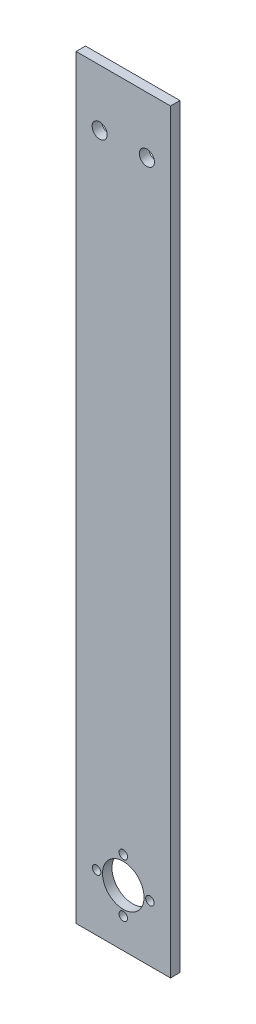
ISO-10303-21;
HEADER;
FILE_DESCRIPTION(('STEP AP214'),'2;1');
FILE_NAME('part.step','',(''),(''),'','','');
FILE_SCHEMA(('AUTOMOTIVE_DESIGN { 1 0 10303 214 1 1 1 1 }'));
ENDSEC;
DATA;
#1=APPLICATION_CONTEXT('core data for automotive mechanical design processes');
#2=APPLICATION_PROTOCOL_DEFINITION('international standard','automotive_design',2000,#1);
#3=PRODUCT_CONTEXT('',#1,'mechanical');
#4=PRODUCT('Part','Part','',(#3));
#5=PRODUCT_RELATED_PRODUCT_CATEGORY('part','',(#4));
#6=PRODUCT_DEFINITION_FORMATION('','',#4);
#7=PRODUCT_DEFINITION_CONTEXT('part definition',#1,'design');
#8=PRODUCT_DEFINITION('design','',#6,#7);
#9=PRODUCT_DEFINITION_SHAPE('','',#8);
#10=(LENGTH_UNIT() NAMED_UNIT(*) SI_UNIT(.MILLI.,.METRE.));
#11=(NAMED_UNIT(*) PLANE_ANGLE_UNIT() SI_UNIT($,.RADIAN.));
#12=(NAMED_UNIT(*) SI_UNIT($,.STERADIAN.) SOLID_ANGLE_UNIT());
#13=UNCERTAINTY_MEASURE_WITH_UNIT(LENGTH_MEASURE(1.E-05),#10,'distance_accuracy_value','');
#14=(GEOMETRIC_REPRESENTATION_CONTEXT(3) GLOBAL_UNCERTAINTY_ASSIGNED_CONTEXT((#13)) GLOBAL_UNIT_ASSIGNED_CONTEXT((#10,
#11,#12)) REPRESENTATION_CONTEXT('',''));
#15=CARTESIAN_POINT('',(0.,0.,0.));
#16=DIRECTION('',(0.,0.,1.));
#17=DIRECTION('',(1.,0.,0.));
#18=AXIS2_PLACEMENT_3D('',#15,#16,#17);
#19=CARTESIAN_POINT('',(0.,0.,5.));
#20=DIRECTION('',(0.,0.,1.));
#21=DIRECTION('',(1.,0.,0.));
#22=AXIS2_PLACEMENT_3D('',#19,#20,#21);
#23=PLANE('',#22);
#24=CARTESIAN_POINT('',(11.4736005745586,-322.394322930041,5.));
#25=DIRECTION('',(0.,0.,1.));
#26=DIRECTION('',(1.,0.,0.));
#27=AXIS2_PLACEMENT_3D('',#24,#25,#26);
#28=CIRCLE('',#27,2.25);
#29=CARTESIAN_POINT('',(13.7236005745586,-322.394322930041,5.));
#30=VERTEX_POINT('',#29);
#31=EDGE_CURVE('E147',#30,#30,#28,.T.);
#32=ORIENTED_EDGE('',*,*,#31,.F.);
#33=EDGE_LOOP('',(#32));
#34=FACE_BOUND('',#33,.T.);
#35=CARTESIAN_POINT('',(11.4736005745586,-308.269322930041,5.));
#36=DIRECTION('',(0.,0.,1.));
#37=DIRECTION('',(1.,0.,0.));
#38=AXIS2_PLACEMENT_3D('',#35,#36,#37);
#39=CIRCLE('',#38,11.);
#40=CARTESIAN_POINT('',(22.4736005745586,-308.269322930041,5.));
#41=VERTEX_POINT('',#40);
#42=EDGE_CURVE('E154',#41,#41,#39,.T.);
#43=ORIENTED_EDGE('',*,*,#42,.F.);
#44=EDGE_LOOP('',(#43));
#45=FACE_BOUND('',#44,.T.);
#46=CARTESIAN_POINT('',(25.5986005745586,-308.269322930041,5.));
#47=DIRECTION('',(0.,0.,1.));
#48=DIRECTION('',(1.,0.,0.));
#49=AXIS2_PLACEMENT_3D('',#46,#47,#48);
#50=CIRCLE('',#49,2.25);
#51=CARTESIAN_POINT('',(27.8486005745586,-308.269322930041,5.));
#52=VERTEX_POINT('',#51);
#53=EDGE_CURVE('E158',#52,#52,#50,.T.);
#54=ORIENTED_EDGE('',*,*,#53,.F.);
#55=EDGE_LOOP('',(#54));
#56=FACE_BOUND('',#55,.T.);
#57=CARTESIAN_POINT('',(11.4736005745586,-294.144322930041,5.));
#58=DIRECTION('',(0.,0.,1.));
#59=DIRECTION('',(1.,0.,0.));
#60=AXIS2_PLACEMENT_3D('',#57,#58,#59);
#61=CIRCLE('',#60,2.25);
#62=CARTESIAN_POINT('',(13.7236005745586,-294.144322930041,5.));
#63=VERTEX_POINT('',#62);
#64=EDGE_CURVE('E162',#63,#63,#61,.T.);
#65=ORIENTED_EDGE('',*,*,#64,.F.);
#66=EDGE_LOOP('',(#65));
#67=FACE_BOUND('',#66,.T.);
#68=CARTESIAN_POINT('',(-2.65139942544137,-308.269322930041,5.));
#69=DIRECTION('',(0.,0.,1.));
#70=DIRECTION('',(1.,0.,0.));
#71=AXIS2_PLACEMENT_3D('',#68,#69,#70);
#72=CIRCLE('',#71,2.25);
#73=CARTESIAN_POINT('',(-0.401399425441367,-308.269322930041,5.));
#74=VERTEX_POINT('',#73);
#75=EDGE_CURVE('E166',#74,#74,#72,.T.);
#76=ORIENTED_EDGE('',*,*,#75,.F.);
#77=EDGE_LOOP('',(#76));
#78=FACE_BOUND('',#77,.T.);
#79=CARTESIAN_POINT('',(23.9736005745586,31.7306770699587,5.));
#80=DIRECTION('',(0.,0.,1.));
#81=DIRECTION('',(1.,0.,0.));
#82=AXIS2_PLACEMENT_3D('',#79,#80,#81);
#83=CIRCLE('',#82,4.);
#84=CARTESIAN_POINT('',(27.9736005745586,31.7306770699587,5.));
#85=VERTEX_POINT('',#84);
#86=EDGE_CURVE('E117',#85,#85,#83,.T.);
#87=ORIENTED_EDGE('',*,*,#86,.F.);
#88=EDGE_LOOP('',(#87));
#89=FACE_BOUND('',#88,.T.);
#90=DIRECTION('',(0.,-1.,0.));
#91=VECTOR('',#90,1.);
#92=CARTESIAN_POINT('',(-13.5263994254414,61.7306770699587,5.));
#93=LINE('',#92,#91);
#94=CARTESIAN_POINT('',(-13.5263994254414,61.7306770699587,5.));
#95=VERTEX_POINT('',#94);
#96=CARTESIAN_POINT('',(-13.5263994254414,-338.269322930041,5.));
#97=VERTEX_POINT('',#96);
#98=EDGE_CURVE('E97',#95,#97,#93,.T.);
#99=ORIENTED_EDGE('',*,*,#98,.T.);
#100=DIRECTION('',(1.,0.,0.));
#101=VECTOR('',#100,1.);
#102=CARTESIAN_POINT('',(-13.5263994254414,-338.269322930041,5.));
#103=LINE('',#102,#101);
#104=CARTESIAN_POINT('',(36.4736005745586,-338.269322930041,5.));
#105=VERTEX_POINT('',#104);
#106=EDGE_CURVE('E92',#97,#105,#103,.T.);
#107=ORIENTED_EDGE('',*,*,#106,.T.);
#108=DIRECTION('',(0.,1.,0.));
#109=VECTOR('',#108,1.);
#110=CARTESIAN_POINT('',(36.4736005745586,61.7306770699587,5.));
#111=LINE('',#110,#109);
#112=CARTESIAN_POINT('',(36.4736005745586,61.7306770699587,5.));
#113=VERTEX_POINT('',#112);
#114=EDGE_CURVE('E95',#105,#113,#111,.T.);
#115=ORIENTED_EDGE('',*,*,#114,.T.);
#116=DIRECTION('',(-1.,0.,0.));
#117=VECTOR('',#116,1.);
#118=CARTESIAN_POINT('',(-13.5263994254414,61.7306770699587,5.));
#119=LINE('',#118,#117);
#120=EDGE_CURVE('E62',#113,#95,#119,.T.);
#121=ORIENTED_EDGE('',*,*,#120,.T.);
#122=EDGE_LOOP('',(#99,#107,#115,#121));
#123=FACE_BOUND('',#122,.T.);
#124=CARTESIAN_POINT('',(-1.02639942544142,31.7306770699587,5.));
#125=DIRECTION('',(0.,0.,1.));
#126=DIRECTION('',(1.,0.,0.));
#127=AXIS2_PLACEMENT_3D('',#124,#125,#126);
#128=CIRCLE('',#127,4.);
#129=CARTESIAN_POINT('',(2.97360057455859,31.7306770699587,5.));
#130=VERTEX_POINT('',#129);
#131=EDGE_CURVE('E139',#130,#130,#128,.T.);
#132=ORIENTED_EDGE('',*,*,#131,.F.);
#133=EDGE_LOOP('',(#132));
#134=FACE_BOUND('',#133,.T.);
#135=ADVANCED_FACE('F44',(#34,#45,#56,#67,#78,#89,#123,#134),#23,.T.);
#136=CARTESIAN_POINT('',(0.,0.,0.));
#137=DIRECTION('',(0.,0.,1.));
#138=DIRECTION('',(1.,0.,0.));
#139=AXIS2_PLACEMENT_3D('',#136,#137,#138);
#140=PLANE('',#139);
#141=CARTESIAN_POINT('',(11.4736005745586,-322.394322930041,0.));
#142=DIRECTION('',(0.,0.,-1.));
#143=DIRECTION('',(-1.,0.,0.));
#144=AXIS2_PLACEMENT_3D('',#141,#142,#143);
#145=CIRCLE('',#144,2.25);
#146=CARTESIAN_POINT('',(9.22360057455863,-322.394322930041,0.));
#147=VERTEX_POINT('',#146);
#148=EDGE_CURVE('E170',#147,#147,#145,.T.);
#149=ORIENTED_EDGE('',*,*,#148,.F.);
#150=EDGE_LOOP('',(#149));
#151=FACE_BOUND('',#150,.T.);
#152=CARTESIAN_POINT('',(11.4736005745586,-308.269322930041,0.));
#153=DIRECTION('',(0.,0.,-1.));
#154=DIRECTION('',(-1.,0.,0.));
#155=AXIS2_PLACEMENT_3D('',#152,#153,#154);
#156=CIRCLE('',#155,11.);
#157=CARTESIAN_POINT('',(0.473600574558626,-308.269322930041,0.));
#158=VERTEX_POINT('',#157);
#159=EDGE_CURVE('E180',#158,#158,#156,.T.);
#160=ORIENTED_EDGE('',*,*,#159,.F.);
#161=EDGE_LOOP('',(#160));
#162=FACE_BOUND('',#161,.T.);
#163=CARTESIAN_POINT('',(25.5986005745586,-308.269322930041,0.));
#164=DIRECTION('',(0.,0.,-1.));
#165=DIRECTION('',(-1.,0.,0.));
#166=AXIS2_PLACEMENT_3D('',#163,#164,#165);
#167=CIRCLE('',#166,2.25);
#168=CARTESIAN_POINT('',(23.3486005745586,-308.269322930041,0.));
#169=VERTEX_POINT('',#168);
#170=EDGE_CURVE('E176',#169,#169,#167,.T.);
#171=ORIENTED_EDGE('',*,*,#170,.F.);
#172=EDGE_LOOP('',(#171));
#173=FACE_BOUND('',#172,.T.);
#174=CARTESIAN_POINT('',(11.4736005745586,-294.144322930041,0.));
#175=DIRECTION('',(0.,0.,-1.));
#176=DIRECTION('',(-1.,0.,0.));
#177=AXIS2_PLACEMENT_3D('',#174,#175,#176);
#178=CIRCLE('',#177,2.25);
#179=CARTESIAN_POINT('',(9.22360057455863,-294.144322930041,0.));
#180=VERTEX_POINT('',#179);
#181=EDGE_CURVE('E171',#180,#180,#178,.T.);
#182=ORIENTED_EDGE('',*,*,#181,.F.);
#183=EDGE_LOOP('',(#182));
#184=FACE_BOUND('',#183,.T.);
#185=CARTESIAN_POINT('',(-2.65139942544137,-308.269322930041,0.));
#186=DIRECTION('',(0.,0.,-1.));
#187=DIRECTION('',(-1.,0.,0.));
#188=AXIS2_PLACEMENT_3D('',#185,#186,#187);
#189=CIRCLE('',#188,2.25);
#190=CARTESIAN_POINT('',(-4.90139942544137,-308.269322930041,0.));
#191=VERTEX_POINT('',#190);
#192=EDGE_CURVE('E175',#191,#191,#189,.T.);
#193=ORIENTED_EDGE('',*,*,#192,.F.);
#194=EDGE_LOOP('',(#193));
#195=FACE_BOUND('',#194,.T.);
#196=DIRECTION('',(0.,-1.,0.));
#197=VECTOR('',#196,1.);
#198=CARTESIAN_POINT('',(-13.5263994254414,61.7306770699587,0.));
#199=LINE('',#198,#197);
#200=CARTESIAN_POINT('',(-13.5263994254414,61.7306770699587,0.));
#201=VERTEX_POINT('',#200);
#202=CARTESIAN_POINT('',(-13.5263994254414,-338.269322930041,0.));
#203=VERTEX_POINT('',#202);
#204=EDGE_CURVE('E113',#201,#203,#199,.T.);
#205=ORIENTED_EDGE('',*,*,#204,.F.);
#206=DIRECTION('',(-1.,0.,0.));
#207=VECTOR('',#206,1.);
#208=CARTESIAN_POINT('',(-13.5263994254414,61.7306770699587,0.));
#209=LINE('',#208,#207);
#210=CARTESIAN_POINT('',(36.4736005745586,61.7306770699587,0.));
#211=VERTEX_POINT('',#210);
#212=EDGE_CURVE('E85',#211,#201,#209,.T.);
#213=ORIENTED_EDGE('',*,*,#212,.F.);
#214=DIRECTION('',(0.,1.,0.));
#215=VECTOR('',#214,1.);
#216=CARTESIAN_POINT('',(36.4736005745586,61.7306770699587,0.));
#217=LINE('',#216,#215);
#218=CARTESIAN_POINT('',(36.4736005745586,-338.269322930041,0.));
#219=VERTEX_POINT('',#218);
#220=EDGE_CURVE('E79',#219,#211,#217,.T.);
#221=ORIENTED_EDGE('',*,*,#220,.F.);
#222=DIRECTION('',(1.,0.,0.));
#223=VECTOR('',#222,1.);
#224=CARTESIAN_POINT('',(-13.5263994254414,-338.269322930041,0.));
#225=LINE('',#224,#223);
#226=EDGE_CURVE('E102',#203,#219,#225,.T.);
#227=ORIENTED_EDGE('',*,*,#226,.F.);
#228=EDGE_LOOP('',(#205,#213,#221,#227));
#229=FACE_BOUND('',#228,.T.);
#230=CARTESIAN_POINT('',(23.9736005745586,31.7306770699587,0.));
#231=DIRECTION('',(0.,0.,1.));
#232=DIRECTION('',(1.,0.,0.));
#233=AXIS2_PLACEMENT_3D('',#230,#231,#232);
#234=CIRCLE('',#233,4.);
#235=CARTESIAN_POINT('',(27.9736005745586,31.7306770699587,0.));
#236=VERTEX_POINT('',#235);
#237=EDGE_CURVE('E135',#236,#236,#234,.T.);
#238=ORIENTED_EDGE('',*,*,#237,.T.);
#239=EDGE_LOOP('',(#238));
#240=FACE_BOUND('',#239,.T.);
#241=CARTESIAN_POINT('',(-1.02639942544142,31.7306770699587,0.));
#242=DIRECTION('',(0.,0.,1.));
#243=DIRECTION('',(1.,0.,0.));
#244=AXIS2_PLACEMENT_3D('',#241,#242,#243);
#245=CIRCLE('',#244,4.);
#246=CARTESIAN_POINT('',(2.97360057455859,31.7306770699587,0.));
#247=VERTEX_POINT('',#246);
#248=EDGE_CURVE('E143',#247,#247,#245,.T.);
#249=ORIENTED_EDGE('',*,*,#248,.T.);
#250=EDGE_LOOP('',(#249));
#251=FACE_BOUND('',#250,.T.);
#252=ADVANCED_FACE('F130',(#151,#162,#173,#184,#195,#229,#240,#251),#140,.F.);
#253=CARTESIAN_POINT('',(-13.5263994254414,61.7306770699587,5.));
#254=DIRECTION('',(1.,0.,0.));
#255=DIRECTION('',(0.,1.,0.));
#256=AXIS2_PLACEMENT_3D('',#253,#254,#255);
#257=PLANE('',#256);
#258=ORIENTED_EDGE('',*,*,#204,.T.);
#259=DIRECTION('',(0.,0.,-1.));
#260=VECTOR('',#259,1.);
#261=CARTESIAN_POINT('',(-13.5263994254414,-338.269322930041,5.));
#262=LINE('',#261,#260);
#263=EDGE_CURVE('E11',#97,#203,#262,.T.);
#264=ORIENTED_EDGE('',*,*,#263,.F.);
#265=ORIENTED_EDGE('',*,*,#98,.F.);
#266=DIRECTION('',(0.,0.,-1.));
#267=VECTOR('',#266,1.);
#268=CARTESIAN_POINT('',(-13.5263994254414,61.7306770699587,5.));
#269=LINE('',#268,#267);
#270=EDGE_CURVE('E109',#95,#201,#269,.T.);
#271=ORIENTED_EDGE('',*,*,#270,.T.);
#272=EDGE_LOOP('',(#258,#264,#265,#271));
#273=FACE_BOUND('',#272,.T.);
#274=ADVANCED_FACE('F46',(#273),#257,.F.);
#275=CARTESIAN_POINT('',(-13.5263994254414,-338.269322930041,5.));
#276=DIRECTION('',(0.,1.,0.));
#277=DIRECTION('',(0.,0.,1.));
#278=AXIS2_PLACEMENT_3D('',#275,#276,#277);
#279=PLANE('',#278);
#280=ORIENTED_EDGE('',*,*,#226,.T.);
#281=DIRECTION('',(0.,0.,-1.));
#282=VECTOR('',#281,1.);
#283=CARTESIAN_POINT('',(36.4736005745586,-338.269322930041,5.));
#284=LINE('',#283,#282);
#285=EDGE_CURVE('E54',#105,#219,#284,.T.);
#286=ORIENTED_EDGE('',*,*,#285,.F.);
#287=ORIENTED_EDGE('',*,*,#106,.F.);
#288=ORIENTED_EDGE('',*,*,#263,.T.);
#289=EDGE_LOOP('',(#280,#286,#287,#288));
#290=FACE_BOUND('',#289,.T.);
#291=ADVANCED_FACE('F101',(#290),#279,.F.);
#292=CARTESIAN_POINT('',(36.4736005745586,61.7306770699587,5.));
#293=DIRECTION('',(-1.,0.,0.));
#294=DIRECTION('',(0.,-1.,0.));
#295=AXIS2_PLACEMENT_3D('',#292,#293,#294);
#296=PLANE('',#295);
#297=ORIENTED_EDGE('',*,*,#220,.T.);
#298=DIRECTION('',(0.,0.,-1.));
#299=VECTOR('',#298,1.);
#300=CARTESIAN_POINT('',(36.4736005745586,61.7306770699587,5.));
#301=LINE('',#300,#299);
#302=EDGE_CURVE('E104',#113,#211,#301,.T.);
#303=ORIENTED_EDGE('',*,*,#302,.F.);
#304=ORIENTED_EDGE('',*,*,#114,.F.);
#305=ORIENTED_EDGE('',*,*,#285,.T.);
#306=EDGE_LOOP('',(#297,#303,#304,#305));
#307=FACE_BOUND('',#306,.T.);
#308=ADVANCED_FACE('F105',(#307),#296,.F.);
#309=CARTESIAN_POINT('',(-13.5263994254414,61.7306770699587,5.));
#310=DIRECTION('',(0.,-1.,0.));
#311=DIRECTION('',(0.,0.,-1.));
#312=AXIS2_PLACEMENT_3D('',#309,#310,#311);
#313=PLANE('',#312);
#314=ORIENTED_EDGE('',*,*,#212,.T.);
#315=ORIENTED_EDGE('',*,*,#270,.F.);
#316=ORIENTED_EDGE('',*,*,#120,.F.);
#317=ORIENTED_EDGE('',*,*,#302,.T.);
#318=EDGE_LOOP('',(#314,#315,#316,#317));
#319=FACE_BOUND('',#318,.T.);
#320=ADVANCED_FACE('F127',(#319),#313,.F.);
#321=CARTESIAN_POINT('',(23.9736005745586,31.7306770699587,5.));
#322=DIRECTION('',(0.,0.,-1.));
#323=DIRECTION('',(-1.,0.,0.));
#324=AXIS2_PLACEMENT_3D('',#321,#322,#323);
#325=CYLINDRICAL_SURFACE('',#324,4.);
#326=ORIENTED_EDGE('',*,*,#86,.T.);
#327=EDGE_LOOP('',(#326));
#328=FACE_BOUND('',#327,.T.);
#329=ORIENTED_EDGE('',*,*,#237,.F.);
#330=EDGE_LOOP('',(#329));
#331=FACE_BOUND('',#330,.T.);
#332=ADVANCED_FACE('F217',(#328,#331),#325,.F.);
#333=CARTESIAN_POINT('',(-1.02639942544142,31.7306770699587,5.));
#334=DIRECTION('',(0.,0.,-1.));
#335=DIRECTION('',(-1.,0.,0.));
#336=AXIS2_PLACEMENT_3D('',#333,#334,#335);
#337=CYLINDRICAL_SURFACE('',#336,4.);
#338=ORIENTED_EDGE('',*,*,#131,.T.);
#339=EDGE_LOOP('',(#338));
#340=FACE_BOUND('',#339,.T.);
#341=ORIENTED_EDGE('',*,*,#248,.F.);
#342=EDGE_LOOP('',(#341));
#343=FACE_BOUND('',#342,.T.);
#344=ADVANCED_FACE('F207',(#340,#343),#337,.F.);
#345=CARTESIAN_POINT('',(-2.65139942544137,-308.269322930041,10.));
#346=DIRECTION('',(0.,0.,-1.));
#347=DIRECTION('',(-1.,0.,0.));
#348=AXIS2_PLACEMENT_3D('',#345,#346,#347);
#349=CYLINDRICAL_SURFACE('',#348,2.25);
#350=ORIENTED_EDGE('',*,*,#75,.T.);
#351=EDGE_LOOP('',(#350));
#352=FACE_BOUND('',#351,.T.);
#353=ORIENTED_EDGE('',*,*,#192,.T.);
#354=EDGE_LOOP('',(#353));
#355=FACE_BOUND('',#354,.T.);
#356=ADVANCED_FACE('F204',(#352,#355),#349,.F.);
#357=CARTESIAN_POINT('',(11.4736005745586,-294.144322930041,10.));
#358=DIRECTION('',(0.,0.,-1.));
#359=DIRECTION('',(-1.,0.,0.));
#360=AXIS2_PLACEMENT_3D('',#357,#358,#359);
#361=CYLINDRICAL_SURFACE('',#360,2.25);
#362=ORIENTED_EDGE('',*,*,#64,.T.);
#363=EDGE_LOOP('',(#362));
#364=FACE_BOUND('',#363,.T.);
#365=ORIENTED_EDGE('',*,*,#181,.T.);
#366=EDGE_LOOP('',(#365));
#367=FACE_BOUND('',#366,.T.);
#368=ADVANCED_FACE('F206',(#364,#367),#361,.F.);
#369=CARTESIAN_POINT('',(25.5986005745586,-308.269322930041,10.));
#370=DIRECTION('',(0.,0.,-1.));
#371=DIRECTION('',(-1.,0.,0.));
#372=AXIS2_PLACEMENT_3D('',#369,#370,#371);
#373=CYLINDRICAL_SURFACE('',#372,2.25);
#374=ORIENTED_EDGE('',*,*,#53,.T.);
#375=EDGE_LOOP('',(#374));
#376=FACE_BOUND('',#375,.T.);
#377=ORIENTED_EDGE('',*,*,#170,.T.);
#378=EDGE_LOOP('',(#377));
#379=FACE_BOUND('',#378,.T.);
#380=ADVANCED_FACE('F214',(#376,#379),#373,.F.);
#381=CARTESIAN_POINT('',(11.4736005745586,-308.269322930041,10.));
#382=DIRECTION('',(0.,0.,-1.));
#383=DIRECTION('',(-1.,0.,0.));
#384=AXIS2_PLACEMENT_3D('',#381,#382,#383);
#385=CYLINDRICAL_SURFACE('',#384,11.);
#386=ORIENTED_EDGE('',*,*,#42,.T.);
#387=EDGE_LOOP('',(#386));
#388=FACE_BOUND('',#387,.T.);
#389=ORIENTED_EDGE('',*,*,#159,.T.);
#390=EDGE_LOOP('',(#389));
#391=FACE_BOUND('',#390,.T.);
#392=ADVANCED_FACE('F328',(#388,#391),#385,.F.);
#393=CARTESIAN_POINT('',(11.4736005745586,-322.394322930041,10.));
#394=DIRECTION('',(0.,0.,-1.));
#395=DIRECTION('',(-1.,0.,0.));
#396=AXIS2_PLACEMENT_3D('',#393,#394,#395);
#397=CYLINDRICAL_SURFACE('',#396,2.25);
#398=ORIENTED_EDGE('',*,*,#31,.T.);
#399=EDGE_LOOP('',(#398));
#400=FACE_BOUND('',#399,.T.);
#401=ORIENTED_EDGE('',*,*,#148,.T.);
#402=EDGE_LOOP('',(#401));
#403=FACE_BOUND('',#402,.T.);
#404=ADVANCED_FACE('F191',(#400,#403),#397,.F.);
#405=CLOSED_SHELL('',(#135,#252,#274,#291,#308,#320,#332,#344,#356,#368,#380,#392,#404));
#406=MANIFOLD_SOLID_BREP('B2',#405);
#407=ADVANCED_BREP_SHAPE_REPRESENTATION('',(#18,#406),#14);
#408=SHAPE_DEFINITION_REPRESENTATION(#9,#407);
ENDSEC;
END-ISO-10303-21;
